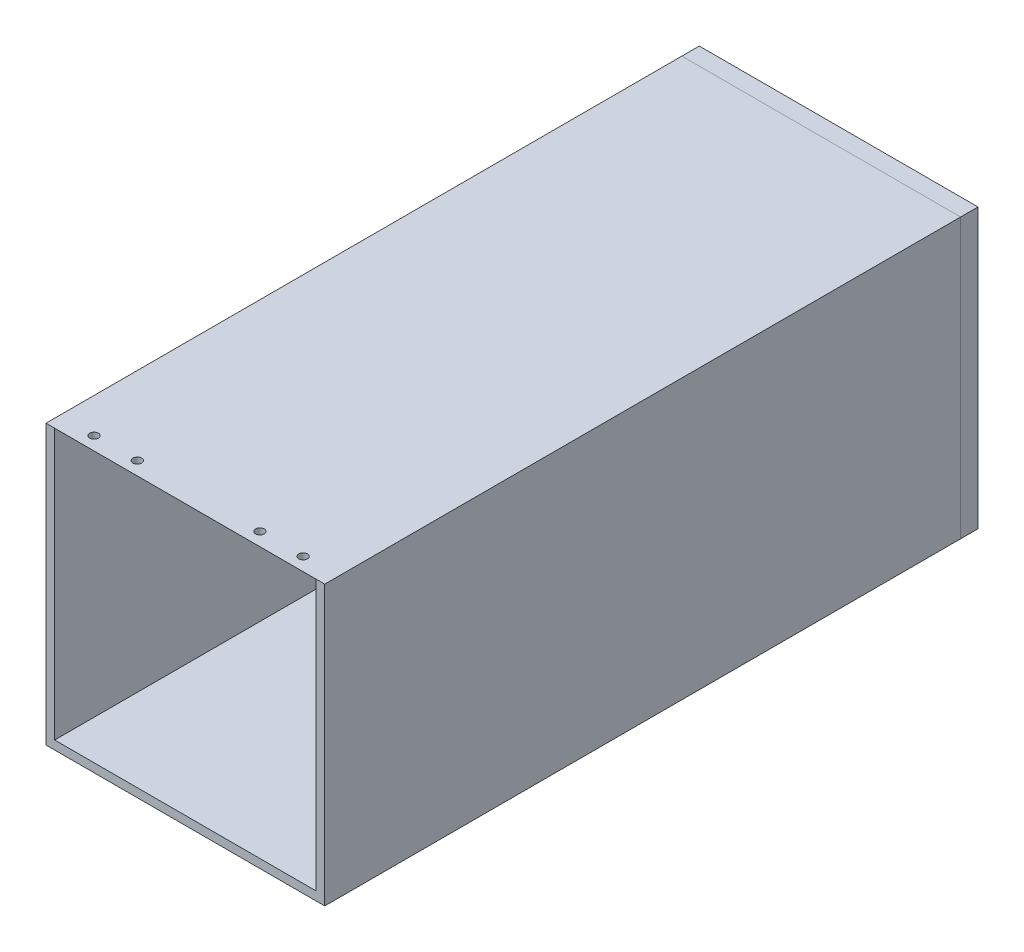
ISO-10303-21;
HEADER;
FILE_DESCRIPTION(('STEP AP214'),'2;1');
FILE_NAME('part.step','',(''),(''),'','','');
FILE_SCHEMA(('AUTOMOTIVE_DESIGN { 1 0 10303 214 1 1 1 1 }'));
ENDSEC;
DATA;
#1=APPLICATION_CONTEXT('core data for automotive mechanical design processes');
#2=APPLICATION_PROTOCOL_DEFINITION('international standard','automotive_design',2000,#1);
#3=PRODUCT_CONTEXT('',#1,'mechanical');
#4=PRODUCT('Part','Part','',(#3));
#5=PRODUCT_RELATED_PRODUCT_CATEGORY('part','',(#4));
#6=PRODUCT_DEFINITION_FORMATION('','',#4);
#7=PRODUCT_DEFINITION_CONTEXT('part definition',#1,'design');
#8=PRODUCT_DEFINITION('design','',#6,#7);
#9=PRODUCT_DEFINITION_SHAPE('','',#8);
#10=(LENGTH_UNIT() NAMED_UNIT(*) SI_UNIT(.MILLI.,.METRE.));
#11=(NAMED_UNIT(*) PLANE_ANGLE_UNIT() SI_UNIT($,.RADIAN.));
#12=(NAMED_UNIT(*) SI_UNIT($,.STERADIAN.) SOLID_ANGLE_UNIT());
#13=UNCERTAINTY_MEASURE_WITH_UNIT(LENGTH_MEASURE(1.E-05),#10,'distance_accuracy_value','');
#14=(GEOMETRIC_REPRESENTATION_CONTEXT(3) GLOBAL_UNCERTAINTY_ASSIGNED_CONTEXT((#13)) GLOBAL_UNIT_ASSIGNED_CONTEXT((#10,
#11,#12)) REPRESENTATION_CONTEXT('',''));
#15=CARTESIAN_POINT('',(0.,0.,0.));
#16=DIRECTION('',(0.,0.,1.));
#17=DIRECTION('',(1.,0.,0.));
#18=AXIS2_PLACEMENT_3D('',#15,#16,#17);
#19=CARTESIAN_POINT('',(-101.6,101.6,-6.35));
#20=DIRECTION('',(0.,-1.,0.));
#21=DIRECTION('',(0.,0.,-1.));
#22=AXIS2_PLACEMENT_3D('',#19,#20,#21);
#23=PLANE('',#22);
#24=DIRECTION('',(1.,0.,0.));
#25=VECTOR('',#24,1.);
#26=CARTESIAN_POINT('',(-101.6,101.6,0.));
#27=LINE('',#26,#25);
#28=CARTESIAN_POINT('',(-101.6,101.6,0.));
#29=VERTEX_POINT('',#28);
#30=CARTESIAN_POINT('',(0.,101.6,0.));
#31=VERTEX_POINT('',#30);
#32=EDGE_CURVE('E111',#29,#31,#27,.T.);
#33=ORIENTED_EDGE('',*,*,#32,.T.);
#34=DIRECTION('',(0.,0.,1.));
#35=VECTOR('',#34,1.);
#36=CARTESIAN_POINT('',(0.,101.6,-6.35));
#37=LINE('',#36,#35);
#38=CARTESIAN_POINT('',(0.,101.6,-6.35));
#39=VERTEX_POINT('',#38);
#40=EDGE_CURVE('E12',#39,#31,#37,.T.);
#41=ORIENTED_EDGE('',*,*,#40,.F.);
#42=DIRECTION('',(1.,0.,0.));
#43=VECTOR('',#42,1.);
#44=CARTESIAN_POINT('',(-101.6,101.6,-6.35));
#45=LINE('',#44,#43);
#46=CARTESIAN_POINT('',(-101.6,101.6,-6.35));
#47=VERTEX_POINT('',#46);
#48=EDGE_CURVE('E105',#47,#39,#45,.T.);
#49=ORIENTED_EDGE('',*,*,#48,.F.);
#50=DIRECTION('',(0.,0.,1.));
#51=VECTOR('',#50,1.);
#52=CARTESIAN_POINT('',(-101.6,101.6,-6.35));
#53=LINE('',#52,#51);
#54=EDGE_CURVE('E109',#47,#29,#53,.T.);
#55=ORIENTED_EDGE('',*,*,#54,.T.);
#56=EDGE_LOOP('',(#33,#41,#49,#55));
#57=FACE_BOUND('',#56,.T.);
#58=ADVANCED_FACE('F51',(#57),#23,.F.);
#59=CARTESIAN_POINT('',(0.,101.6,-6.35));
#60=DIRECTION('',(-1.,0.,0.));
#61=DIRECTION('',(0.,-1.,0.));
#62=AXIS2_PLACEMENT_3D('',#59,#60,#61);
#63=PLANE('',#62);
#64=DIRECTION('',(0.,-1.,0.));
#65=VECTOR('',#64,1.);
#66=CARTESIAN_POINT('',(0.,101.6,0.));
#67=LINE('',#66,#65);
#68=CARTESIAN_POINT('',(0.,0.,0.));
#69=VERTEX_POINT('',#68);
#70=EDGE_CURVE('E106',#31,#69,#67,.T.);
#71=ORIENTED_EDGE('',*,*,#70,.T.);
#72=DIRECTION('',(0.,0.,1.));
#73=VECTOR('',#72,1.);
#74=CARTESIAN_POINT('',(0.,0.,-6.35));
#75=LINE('',#74,#73);
#76=CARTESIAN_POINT('',(0.,0.,-6.35));
#77=VERTEX_POINT('',#76);
#78=EDGE_CURVE('E56',#77,#69,#75,.T.);
#79=ORIENTED_EDGE('',*,*,#78,.F.);
#80=DIRECTION('',(0.,-1.,0.));
#81=VECTOR('',#80,1.);
#82=CARTESIAN_POINT('',(0.,101.6,-6.35));
#83=LINE('',#82,#81);
#84=EDGE_CURVE('E100',#39,#77,#83,.T.);
#85=ORIENTED_EDGE('',*,*,#84,.F.);
#86=ORIENTED_EDGE('',*,*,#40,.T.);
#87=EDGE_LOOP('',(#71,#79,#85,#86));
#88=FACE_BOUND('',#87,.T.);
#89=ADVANCED_FACE('F104',(#88),#63,.F.);
#90=CARTESIAN_POINT('',(0.,0.,-6.35));
#91=DIRECTION('',(0.,1.,0.));
#92=DIRECTION('',(-1.,0.,0.));
#93=AXIS2_PLACEMENT_3D('',#90,#91,#92);
#94=PLANE('',#93);
#95=DIRECTION('',(-1.,0.,0.));
#96=VECTOR('',#95,1.);
#97=CARTESIAN_POINT('',(0.,0.,0.));
#98=LINE('',#97,#96);
#99=CARTESIAN_POINT('',(-101.6,0.,0.));
#100=VERTEX_POINT('',#99);
#101=EDGE_CURVE('E84',#69,#100,#98,.T.);
#102=ORIENTED_EDGE('',*,*,#101,.T.);
#103=DIRECTION('',(0.,0.,1.));
#104=VECTOR('',#103,1.);
#105=CARTESIAN_POINT('',(-101.6,0.,-6.35));
#106=LINE('',#105,#104);
#107=CARTESIAN_POINT('',(-101.6,0.,-6.35));
#108=VERTEX_POINT('',#107);
#109=EDGE_CURVE('E110',#108,#100,#106,.T.);
#110=ORIENTED_EDGE('',*,*,#109,.F.);
#111=DIRECTION('',(-1.,0.,0.));
#112=VECTOR('',#111,1.);
#113=CARTESIAN_POINT('',(0.,0.,-6.35));
#114=LINE('',#113,#112);
#115=EDGE_CURVE('E99',#77,#108,#114,.T.);
#116=ORIENTED_EDGE('',*,*,#115,.F.);
#117=ORIENTED_EDGE('',*,*,#78,.T.);
#118=EDGE_LOOP('',(#102,#110,#116,#117));
#119=FACE_BOUND('',#118,.T.);
#120=ADVANCED_FACE('F107',(#119),#94,.F.);
#121=CARTESIAN_POINT('',(-101.6,0.,-6.35));
#122=DIRECTION('',(1.,0.,0.));
#123=DIRECTION('',(0.,1.,0.));
#124=AXIS2_PLACEMENT_3D('',#121,#122,#123);
#125=PLANE('',#124);
#126=DIRECTION('',(0.,1.,0.));
#127=VECTOR('',#126,1.);
#128=CARTESIAN_POINT('',(-101.6,0.,0.));
#129=LINE('',#128,#127);
#130=EDGE_CURVE('E89',#100,#29,#129,.T.);
#131=ORIENTED_EDGE('',*,*,#130,.T.);
#132=ORIENTED_EDGE('',*,*,#54,.F.);
#133=DIRECTION('',(0.,1.,0.));
#134=VECTOR('',#133,1.);
#135=CARTESIAN_POINT('',(-101.6,0.,-6.35));
#136=LINE('',#135,#134);
#137=EDGE_CURVE('E70',#108,#47,#136,.T.);
#138=ORIENTED_EDGE('',*,*,#137,.F.);
#139=ORIENTED_EDGE('',*,*,#109,.T.);
#140=EDGE_LOOP('',(#131,#132,#138,#139));
#141=FACE_BOUND('',#140,.T.);
#142=ADVANCED_FACE('F122',(#141),#125,.F.);
#143=CARTESIAN_POINT('',(0.,0.,-6.35));
#144=DIRECTION('',(0.,0.,-1.));
#145=DIRECTION('',(-1.,0.,0.));
#146=AXIS2_PLACEMENT_3D('',#143,#144,#145);
#147=PLANE('',#146);
#148=ORIENTED_EDGE('',*,*,#48,.T.);
#149=ORIENTED_EDGE('',*,*,#84,.T.);
#150=ORIENTED_EDGE('',*,*,#115,.T.);
#151=ORIENTED_EDGE('',*,*,#137,.T.);
#152=EDGE_LOOP('',(#148,#149,#150,#151));
#153=FACE_BOUND('',#152,.T.);
#154=ADVANCED_FACE('F98',(#153),#147,.T.);
#155=CARTESIAN_POINT('',(0.,0.,0.));
#156=DIRECTION('',(0.,0.,-1.));
#157=DIRECTION('',(-1.,0.,0.));
#158=AXIS2_PLACEMENT_3D('',#155,#156,#157);
#159=PLANE('',#158);
#160=ORIENTED_EDGE('',*,*,#32,.F.);
#161=ORIENTED_EDGE('',*,*,#130,.F.);
#162=ORIENTED_EDGE('',*,*,#101,.F.);
#163=ORIENTED_EDGE('',*,*,#70,.F.);
#164=EDGE_LOOP('',(#160,#161,#162,#163));
#165=FACE_BOUND('',#164,.T.);
#166=ADVANCED_FACE('F124',(#165),#159,.F.);
#167=CLOSED_SHELL('',(#58,#89,#120,#142,#154,#166));
#168=MANIFOLD_SOLID_BREP('B2',#167);
#169=CARTESIAN_POINT('',(0.,0.,231.775));
#170=DIRECTION('',(0.,0.,1.));
#171=DIRECTION('',(1.,0.,0.));
#172=AXIS2_PLACEMENT_3D('',#169,#170,#171);
#173=PLANE('',#172);
#174=DIRECTION('',(0.,-1.,0.));
#175=VECTOR('',#174,1.);
#176=CARTESIAN_POINT('',(-98.425,98.425,231.775));
#177=LINE('',#176,#175);
#178=CARTESIAN_POINT('',(-98.425,101.6,231.775));
#179=VERTEX_POINT('',#178);
#180=CARTESIAN_POINT('',(-98.425,3.17499999999999,231.775));
#181=VERTEX_POINT('',#180);
#182=EDGE_CURVE('E193',#179,#181,#177,.T.);
#183=ORIENTED_EDGE('',*,*,#182,.F.);
#184=DIRECTION('',(-1.,0.,0.));
#185=VECTOR('',#184,1.);
#186=CARTESIAN_POINT('',(0.,101.6,231.775));
#187=LINE('',#186,#185);
#188=CARTESIAN_POINT('',(-101.6,101.6,231.775));
#189=VERTEX_POINT('',#188);
#190=EDGE_CURVE('E287',#179,#189,#187,.T.);
#191=ORIENTED_EDGE('',*,*,#190,.T.);
#192=DIRECTION('',(0.,-1.,0.));
#193=VECTOR('',#192,1.);
#194=CARTESIAN_POINT('',(-101.6,0.,231.775));
#195=LINE('',#194,#193);
#196=CARTESIAN_POINT('',(-101.6,0.,231.775));
#197=VERTEX_POINT('',#196);
#198=EDGE_CURVE('E286',#189,#197,#195,.T.);
#199=ORIENTED_EDGE('',*,*,#198,.T.);
#200=DIRECTION('',(1.,0.,0.));
#201=VECTOR('',#200,1.);
#202=CARTESIAN_POINT('',(0.,0.,231.775));
#203=LINE('',#202,#201);
#204=CARTESIAN_POINT('',(0.,0.,231.775));
#205=VERTEX_POINT('',#204);
#206=EDGE_CURVE('E291',#197,#205,#203,.T.);
#207=ORIENTED_EDGE('',*,*,#206,.T.);
#208=DIRECTION('',(0.,1.,0.));
#209=VECTOR('',#208,1.);
#210=CARTESIAN_POINT('',(0.,0.,231.775));
#211=LINE('',#210,#209);
#212=CARTESIAN_POINT('',(0.,101.6,231.775));
#213=VERTEX_POINT('',#212);
#214=EDGE_CURVE('E285',#205,#213,#211,.T.);
#215=ORIENTED_EDGE('',*,*,#214,.T.);
#216=CARTESIAN_POINT('',(-3.175,101.6,231.775));
#217=VERTEX_POINT('',#216);
#218=EDGE_CURVE('E288',#213,#217,#187,.T.);
#219=ORIENTED_EDGE('',*,*,#218,.T.);
#220=DIRECTION('',(0.,1.,0.));
#221=VECTOR('',#220,1.);
#222=CARTESIAN_POINT('',(-3.175,98.425,231.775));
#223=LINE('',#222,#221);
#224=CARTESIAN_POINT('',(-3.17499999999998,3.17499999999999,231.775));
#225=VERTEX_POINT('',#224);
#226=EDGE_CURVE('E199',#225,#217,#223,.T.);
#227=ORIENTED_EDGE('',*,*,#226,.F.);
#228=DIRECTION('',(1.,0.,0.));
#229=VECTOR('',#228,1.);
#230=CARTESIAN_POINT('',(-98.425,3.17499999999999,231.775));
#231=LINE('',#230,#229);
#232=EDGE_CURVE('E254',#181,#225,#231,.T.);
#233=ORIENTED_EDGE('',*,*,#232,.F.);
#234=EDGE_LOOP('',(#183,#191,#199,#207,#215,#219,#227,#233));
#235=FACE_BOUND('',#234,.T.);
#236=ADVANCED_FACE('F172',(#235),#173,.T.);
#237=CARTESIAN_POINT('',(0.,0.,0.));
#238=DIRECTION('',(0.,0.,1.));
#239=DIRECTION('',(1.,0.,0.));
#240=AXIS2_PLACEMENT_3D('',#237,#238,#239);
#241=PLANE('',#240);
#242=DIRECTION('',(0.,1.,0.));
#243=VECTOR('',#242,1.);
#244=CARTESIAN_POINT('',(0.,0.,0.));
#245=LINE('',#244,#243);
#246=CARTESIAN_POINT('',(0.,0.,0.));
#247=VERTEX_POINT('',#246);
#248=CARTESIAN_POINT('',(0.,101.6,0.));
#249=VERTEX_POINT('',#248);
#250=EDGE_CURVE('E265',#247,#249,#245,.T.);
#251=ORIENTED_EDGE('',*,*,#250,.F.);
#252=DIRECTION('',(1.,0.,0.));
#253=VECTOR('',#252,1.);
#254=CARTESIAN_POINT('',(0.,0.,0.));
#255=LINE('',#254,#253);
#256=CARTESIAN_POINT('',(-101.6,0.,0.));
#257=VERTEX_POINT('',#256);
#258=EDGE_CURVE('E290',#257,#247,#255,.T.);
#259=ORIENTED_EDGE('',*,*,#258,.F.);
#260=DIRECTION('',(0.,-1.,0.));
#261=VECTOR('',#260,1.);
#262=CARTESIAN_POINT('',(-101.6,0.,0.));
#263=LINE('',#262,#261);
#264=CARTESIAN_POINT('',(-101.6,101.6,0.));
#265=VERTEX_POINT('',#264);
#266=EDGE_CURVE('E297',#265,#257,#263,.T.);
#267=ORIENTED_EDGE('',*,*,#266,.F.);
#268=DIRECTION('',(-1.,0.,0.));
#269=VECTOR('',#268,1.);
#270=CARTESIAN_POINT('',(0.,101.6,0.));
#271=LINE('',#270,#269);
#272=EDGE_CURVE('E300',#249,#265,#271,.T.);
#273=ORIENTED_EDGE('',*,*,#272,.F.);
#274=EDGE_LOOP('',(#251,#259,#267,#273));
#275=FACE_BOUND('',#274,.T.);
#276=DIRECTION('',(0.,-1.,0.));
#277=VECTOR('',#276,1.);
#278=CARTESIAN_POINT('',(-98.425,98.425,0.));
#279=LINE('',#278,#277);
#280=CARTESIAN_POINT('',(-98.425,98.425,0.));
#281=VERTEX_POINT('',#280);
#282=CARTESIAN_POINT('',(-98.425,3.17499999999999,0.));
#283=VERTEX_POINT('',#282);
#284=EDGE_CURVE('E271',#281,#283,#279,.T.);
#285=ORIENTED_EDGE('',*,*,#284,.T.);
#286=DIRECTION('',(1.,0.,0.));
#287=VECTOR('',#286,1.);
#288=CARTESIAN_POINT('',(-98.425,3.17499999999999,0.));
#289=LINE('',#288,#287);
#290=CARTESIAN_POINT('',(-3.17499999999998,3.17499999999999,0.));
#291=VERTEX_POINT('',#290);
#292=EDGE_CURVE('E261',#283,#291,#289,.T.);
#293=ORIENTED_EDGE('',*,*,#292,.T.);
#294=DIRECTION('',(0.,1.,0.));
#295=VECTOR('',#294,1.);
#296=CARTESIAN_POINT('',(-3.175,98.425,0.));
#297=LINE('',#296,#295);
#298=CARTESIAN_POINT('',(-3.175,98.425,0.));
#299=VERTEX_POINT('',#298);
#300=EDGE_CURVE('E273',#291,#299,#297,.T.);
#301=ORIENTED_EDGE('',*,*,#300,.T.);
#302=DIRECTION('',(-1.,0.,0.));
#303=VECTOR('',#302,1.);
#304=CARTESIAN_POINT('',(-98.425,98.425,0.));
#305=LINE('',#304,#303);
#306=EDGE_CURVE('E258',#299,#281,#305,.T.);
#307=ORIENTED_EDGE('',*,*,#306,.T.);
#308=EDGE_LOOP('',(#285,#293,#301,#307));
#309=FACE_BOUND('',#308,.T.);
#310=ADVANCED_FACE('F367',(#275,#309),#241,.F.);
#311=CARTESIAN_POINT('',(0.,0.,231.775));
#312=DIRECTION('',(-1.,0.,0.));
#313=DIRECTION('',(0.,-1.,0.));
#314=AXIS2_PLACEMENT_3D('',#311,#312,#313);
#315=PLANE('',#314);
#316=ORIENTED_EDGE('',*,*,#250,.T.);
#317=DIRECTION('',(0.,0.,-1.));
#318=VECTOR('',#317,1.);
#319=CARTESIAN_POINT('',(0.,101.6,231.775));
#320=LINE('',#319,#318);
#321=EDGE_CURVE('E313',#213,#249,#320,.T.);
#322=ORIENTED_EDGE('',*,*,#321,.F.);
#323=ORIENTED_EDGE('',*,*,#214,.F.);
#324=DIRECTION('',(0.,0.,-1.));
#325=VECTOR('',#324,1.);
#326=CARTESIAN_POINT('',(0.,0.,231.775));
#327=LINE('',#326,#325);
#328=EDGE_CURVE('E293',#205,#247,#327,.T.);
#329=ORIENTED_EDGE('',*,*,#328,.T.);
#330=EDGE_LOOP('',(#316,#322,#323,#329));
#331=FACE_BOUND('',#330,.T.);
#332=ADVANCED_FACE('F370',(#331),#315,.F.);
#333=CARTESIAN_POINT('',(0.,101.6,231.775));
#334=DIRECTION('',(0.,-1.,0.));
#335=DIRECTION('',(0.,0.,-1.));
#336=AXIS2_PLACEMENT_3D('',#333,#334,#335);
#337=PLANE('',#336);
#338=CARTESIAN_POINT('',(-88.9,101.6,226.949));
#339=DIRECTION('',(0.,1.,0.));
#340=DIRECTION('',(0.,0.,1.));
#341=AXIS2_PLACEMENT_3D('',#338,#339,#340);
#342=CIRCLE('',#341,1.58749999999999);
#343=CARTESIAN_POINT('',(-88.9,101.6,228.5365));
#344=VERTEX_POINT('',#343);
#345=EDGE_CURVE('E325',#344,#344,#342,.T.);
#346=ORIENTED_EDGE('',*,*,#345,.F.);
#347=EDGE_LOOP('',(#346));
#348=FACE_BOUND('',#347,.T.);
#349=CARTESIAN_POINT('',(-73.152,101.6,226.949));
#350=DIRECTION('',(0.,1.,0.));
#351=DIRECTION('',(0.,0.,1.));
#352=AXIS2_PLACEMENT_3D('',#349,#350,#351);
#353=CIRCLE('',#352,1.5875);
#354=CARTESIAN_POINT('',(-73.152,101.6,228.5365));
#355=VERTEX_POINT('',#354);
#356=EDGE_CURVE('E479',#355,#355,#353,.T.);
#357=ORIENTED_EDGE('',*,*,#356,.F.);
#358=EDGE_LOOP('',(#357));
#359=FACE_BOUND('',#358,.T.);
#360=CARTESIAN_POINT('',(-28.448,101.6,226.949));
#361=DIRECTION('',(0.,1.,0.));
#362=DIRECTION('',(0.,0.,1.));
#363=AXIS2_PLACEMENT_3D('',#360,#361,#362);
#364=CIRCLE('',#363,1.5875);
#365=CARTESIAN_POINT('',(-28.448,101.6,228.5365));
#366=VERTEX_POINT('',#365);
#367=EDGE_CURVE('E481',#366,#366,#364,.T.);
#368=ORIENTED_EDGE('',*,*,#367,.F.);
#369=EDGE_LOOP('',(#368));
#370=FACE_BOUND('',#369,.T.);
#371=CARTESIAN_POINT('',(-12.7,101.6,226.949));
#372=DIRECTION('',(0.,1.,0.));
#373=DIRECTION('',(0.,0.,1.));
#374=AXIS2_PLACEMENT_3D('',#371,#372,#373);
#375=CIRCLE('',#374,1.5875);
#376=CARTESIAN_POINT('',(-12.7,101.6,228.5365));
#377=VERTEX_POINT('',#376);
#378=EDGE_CURVE('E486',#377,#377,#375,.T.);
#379=ORIENTED_EDGE('',*,*,#378,.F.);
#380=EDGE_LOOP('',(#379));
#381=FACE_BOUND('',#380,.T.);
#382=ORIENTED_EDGE('',*,*,#272,.T.);
#383=DIRECTION('',(0.,0.,-1.));
#384=VECTOR('',#383,1.);
#385=CARTESIAN_POINT('',(-101.6,101.6,231.775));
#386=LINE('',#385,#384);
#387=EDGE_CURVE('E306',#189,#265,#386,.T.);
#388=ORIENTED_EDGE('',*,*,#387,.F.);
#389=ORIENTED_EDGE('',*,*,#190,.F.);
#390=EDGE_CURVE('E292',#217,#179,#187,.T.);
#391=ORIENTED_EDGE('',*,*,#390,.F.);
#392=ORIENTED_EDGE('',*,*,#218,.F.);
#393=ORIENTED_EDGE('',*,*,#321,.T.);
#394=EDGE_LOOP('',(#382,#388,#389,#391,#392,#393));
#395=FACE_BOUND('',#394,.T.);
#396=ADVANCED_FACE('F352',(#348,#359,#370,#381,#395),#337,.F.);
#397=CARTESIAN_POINT('',(-101.6,0.,231.775));
#398=DIRECTION('',(1.,0.,0.));
#399=DIRECTION('',(0.,1.,0.));
#400=AXIS2_PLACEMENT_3D('',#397,#398,#399);
#401=PLANE('',#400);
#402=ORIENTED_EDGE('',*,*,#266,.T.);
#403=DIRECTION('',(0.,0.,-1.));
#404=VECTOR('',#403,1.);
#405=CARTESIAN_POINT('',(-101.6,0.,231.775));
#406=LINE('',#405,#404);
#407=EDGE_CURVE('E301',#197,#257,#406,.T.);
#408=ORIENTED_EDGE('',*,*,#407,.F.);
#409=ORIENTED_EDGE('',*,*,#198,.F.);
#410=ORIENTED_EDGE('',*,*,#387,.T.);
#411=EDGE_LOOP('',(#402,#408,#409,#410));
#412=FACE_BOUND('',#411,.T.);
#413=ADVANCED_FACE('F358',(#412),#401,.F.);
#414=CARTESIAN_POINT('',(0.,0.,231.775));
#415=DIRECTION('',(0.,1.,0.));
#416=DIRECTION('',(-1.,0.,0.));
#417=AXIS2_PLACEMENT_3D('',#414,#415,#416);
#418=PLANE('',#417);
#419=ORIENTED_EDGE('',*,*,#258,.T.);
#420=ORIENTED_EDGE('',*,*,#328,.F.);
#421=ORIENTED_EDGE('',*,*,#206,.F.);
#422=ORIENTED_EDGE('',*,*,#407,.T.);
#423=EDGE_LOOP('',(#419,#420,#421,#422));
#424=FACE_BOUND('',#423,.T.);
#425=ADVANCED_FACE('F361',(#424),#418,.F.);
#426=CARTESIAN_POINT('',(-98.425,98.425,231.775));
#427=DIRECTION('',(1.,0.,0.));
#428=DIRECTION('',(0.,1.,0.));
#429=AXIS2_PLACEMENT_3D('',#426,#427,#428);
#430=PLANE('',#429);
#431=ORIENTED_EDGE('',*,*,#284,.F.);
#432=DIRECTION('',(0.,0.,-1.));
#433=VECTOR('',#432,1.);
#434=CARTESIAN_POINT('',(-98.425,98.425,231.775));
#435=LINE('',#434,#433);
#436=CARTESIAN_POINT('',(-98.425,98.425,228.6));
#437=VERTEX_POINT('',#436);
#438=EDGE_CURVE('E270',#437,#281,#435,.T.);
#439=ORIENTED_EDGE('',*,*,#438,.F.);
#440=DIRECTION('',(0.,-0.707106781186548,-0.707106781186548));
#441=VECTOR('',#440,1.);
#442=CARTESIAN_POINT('',(-98.425,98.425,228.6));
#443=LINE('',#442,#441);
#444=EDGE_CURVE('E183',#437,#179,#443,.F.);
#445=ORIENTED_EDGE('',*,*,#444,.T.);
#446=ORIENTED_EDGE('',*,*,#182,.T.);
#447=DIRECTION('',(0.,0.,-1.));
#448=VECTOR('',#447,1.);
#449=CARTESIAN_POINT('',(-98.425,3.17499999999999,231.775));
#450=LINE('',#449,#448);
#451=EDGE_CURVE('E253',#181,#283,#450,.T.);
#452=ORIENTED_EDGE('',*,*,#451,.T.);
#453=EDGE_LOOP('',(#431,#439,#445,#446,#452));
#454=FACE_BOUND('',#453,.T.);
#455=ADVANCED_FACE('F246',(#454),#430,.T.);
#456=CARTESIAN_POINT('',(-98.425,3.17499999999999,231.775));
#457=DIRECTION('',(0.,1.,0.));
#458=DIRECTION('',(0.,0.,1.));
#459=AXIS2_PLACEMENT_3D('',#456,#457,#458);
#460=PLANE('',#459);
#461=ORIENTED_EDGE('',*,*,#292,.F.);
#462=ORIENTED_EDGE('',*,*,#451,.F.);
#463=ORIENTED_EDGE('',*,*,#232,.T.);
#464=DIRECTION('',(0.,0.,-1.));
#465=VECTOR('',#464,1.);
#466=CARTESIAN_POINT('',(-3.17499999999998,3.17499999999999,231.775));
#467=LINE('',#466,#465);
#468=EDGE_CURVE('E263',#225,#291,#467,.T.);
#469=ORIENTED_EDGE('',*,*,#468,.T.);
#470=EDGE_LOOP('',(#461,#462,#463,#469));
#471=FACE_BOUND('',#470,.T.);
#472=ADVANCED_FACE('F259',(#471),#460,.T.);
#473=CARTESIAN_POINT('',(-3.175,98.425,231.775));
#474=DIRECTION('',(-1.,0.,0.));
#475=DIRECTION('',(0.,-1.,0.));
#476=AXIS2_PLACEMENT_3D('',#473,#474,#475);
#477=PLANE('',#476);
#478=ORIENTED_EDGE('',*,*,#300,.F.);
#479=ORIENTED_EDGE('',*,*,#468,.F.);
#480=ORIENTED_EDGE('',*,*,#226,.T.);
#481=DIRECTION('',(0.,0.707106781186548,0.707106781186548));
#482=VECTOR('',#481,1.);
#483=CARTESIAN_POINT('',(-3.175,98.425,228.6));
#484=LINE('',#483,#482);
#485=CARTESIAN_POINT('',(-3.175,98.425,228.6));
#486=VERTEX_POINT('',#485);
#487=EDGE_CURVE('E47',#217,#486,#484,.F.);
#488=ORIENTED_EDGE('',*,*,#487,.T.);
#489=DIRECTION('',(0.,0.,-1.));
#490=VECTOR('',#489,1.);
#491=CARTESIAN_POINT('',(-3.175,98.425,231.775));
#492=LINE('',#491,#490);
#493=EDGE_CURVE('E278',#486,#299,#492,.T.);
#494=ORIENTED_EDGE('',*,*,#493,.T.);
#495=EDGE_LOOP('',(#478,#479,#480,#488,#494));
#496=FACE_BOUND('',#495,.T.);
#497=ADVANCED_FACE('F336',(#496),#477,.T.);
#498=CARTESIAN_POINT('',(-98.425,98.425,231.775));
#499=DIRECTION('',(0.,-1.,0.));
#500=DIRECTION('',(0.,0.,-1.));
#501=AXIS2_PLACEMENT_3D('',#498,#499,#500);
#502=PLANE('',#501);
#503=CARTESIAN_POINT('',(-88.9,98.425,226.949));
#504=DIRECTION('',(0.,-1.,0.));
#505=DIRECTION('',(0.,0.,-1.));
#506=AXIS2_PLACEMENT_3D('',#503,#504,#505);
#507=CIRCLE('',#506,1.58749999999999);
#508=CARTESIAN_POINT('',(-88.9,98.425,228.5365));
#509=VERTEX_POINT('',#508);
#510=EDGE_CURVE('E176',#509,#509,#507,.T.);
#511=ORIENTED_EDGE('',*,*,#510,.F.);
#512=EDGE_LOOP('',(#511));
#513=FACE_BOUND('',#512,.T.);
#514=CARTESIAN_POINT('',(-73.152,98.425,226.949));
#515=DIRECTION('',(0.,-1.,0.));
#516=DIRECTION('',(0.,0.,-1.));
#517=AXIS2_PLACEMENT_3D('',#514,#515,#516);
#518=CIRCLE('',#517,1.5875);
#519=CARTESIAN_POINT('',(-73.152,98.425,228.5365));
#520=VERTEX_POINT('',#519);
#521=EDGE_CURVE('E322',#520,#520,#518,.T.);
#522=ORIENTED_EDGE('',*,*,#521,.F.);
#523=EDGE_LOOP('',(#522));
#524=FACE_BOUND('',#523,.T.);
#525=CARTESIAN_POINT('',(-28.448,98.425,226.949));
#526=DIRECTION('',(0.,-1.,0.));
#527=DIRECTION('',(0.,0.,-1.));
#528=AXIS2_PLACEMENT_3D('',#525,#526,#527);
#529=CIRCLE('',#528,1.5875);
#530=CARTESIAN_POINT('',(-28.448,98.425,228.5365));
#531=VERTEX_POINT('',#530);
#532=EDGE_CURVE('E321',#531,#531,#529,.T.);
#533=ORIENTED_EDGE('',*,*,#532,.F.);
#534=EDGE_LOOP('',(#533));
#535=FACE_BOUND('',#534,.T.);
#536=CARTESIAN_POINT('',(-12.7,98.425,226.949));
#537=DIRECTION('',(0.,-1.,0.));
#538=DIRECTION('',(0.,0.,-1.));
#539=AXIS2_PLACEMENT_3D('',#536,#537,#538);
#540=CIRCLE('',#539,1.5875);
#541=CARTESIAN_POINT('',(-12.7,98.425,228.5365));
#542=VERTEX_POINT('',#541);
#543=EDGE_CURVE('E318',#542,#542,#540,.T.);
#544=ORIENTED_EDGE('',*,*,#543,.F.);
#545=EDGE_LOOP('',(#544));
#546=FACE_BOUND('',#545,.T.);
#547=ORIENTED_EDGE('',*,*,#493,.F.);
#548=DIRECTION('',(-1.,0.,0.));
#549=VECTOR('',#548,1.);
#550=CARTESIAN_POINT('',(-98.425,98.425,228.6));
#551=LINE('',#550,#549);
#552=EDGE_CURVE('E314',#486,#437,#551,.T.);
#553=ORIENTED_EDGE('',*,*,#552,.T.);
#554=ORIENTED_EDGE('',*,*,#438,.T.);
#555=ORIENTED_EDGE('',*,*,#306,.F.);
#556=EDGE_LOOP('',(#547,#553,#554,#555));
#557=FACE_BOUND('',#556,.T.);
#558=ADVANCED_FACE('F331',(#513,#524,#535,#546,#557),#502,.T.);
#559=CARTESIAN_POINT('',(-98.425,98.425,228.6));
#560=DIRECTION('',(0.,0.707106781186548,-0.707106781186548));
#561=DIRECTION('',(-1.,0.,0.));
#562=AXIS2_PLACEMENT_3D('',#559,#560,#561);
#563=PLANE('',#562);
#564=ORIENTED_EDGE('',*,*,#487,.F.);
#565=ORIENTED_EDGE('',*,*,#390,.T.);
#566=ORIENTED_EDGE('',*,*,#444,.F.);
#567=ORIENTED_EDGE('',*,*,#552,.F.);
#568=EDGE_LOOP('',(#564,#565,#566,#567));
#569=FACE_BOUND('',#568,.T.);
#570=ADVANCED_FACE('F178',(#569),#563,.F.);
#571=CARTESIAN_POINT('',(-12.7,83.82,226.949));
#572=DIRECTION('',(0.,1.,0.));
#573=DIRECTION('',(0.,0.,1.));
#574=AXIS2_PLACEMENT_3D('',#571,#572,#573);
#575=CYLINDRICAL_SURFACE('',#574,1.5875);
#576=CARTESIAN_POINT('',(-12.7,98.425,228.5365));
#577=CARTESIAN_POINT('',(-12.7,98.4580729166667,228.5365));
#578=CARTESIAN_POINT('',(-12.7,98.4911458333333,228.5365));
#579=CARTESIAN_POINT('',(-12.7,98.5572916666667,228.5365));
#580=CARTESIAN_POINT('',(-12.7,98.5903645833333,228.5365));
#581=CARTESIAN_POINT('',(-12.7,98.6565104166667,228.5365));
#582=CARTESIAN_POINT('',(-12.7,98.6895833333333,228.5365));
#583=CARTESIAN_POINT('',(-12.7,98.7557291666667,228.5365));
#584=CARTESIAN_POINT('',(-12.7,98.7888020833333,228.5365));
#585=CARTESIAN_POINT('',(-12.7,98.8549479166667,228.5365));
#586=CARTESIAN_POINT('',(-12.7,98.8880208333333,228.5365));
#587=CARTESIAN_POINT('',(-12.7,98.9541666666667,228.5365));
#588=CARTESIAN_POINT('',(-12.7,98.9872395833333,228.5365));
#589=CARTESIAN_POINT('',(-12.7,99.0533854166667,228.5365));
#590=CARTESIAN_POINT('',(-12.7,99.0864583333333,228.5365));
#591=CARTESIAN_POINT('',(-12.7,99.1526041666667,228.5365));
#592=CARTESIAN_POINT('',(-12.7,99.1856770833333,228.5365));
#593=CARTESIAN_POINT('',(-12.7,99.2518229166667,228.5365));
#594=CARTESIAN_POINT('',(-12.7,99.2848958333333,228.5365));
#595=CARTESIAN_POINT('',(-12.7,99.3510416666667,228.5365));
#596=CARTESIAN_POINT('',(-12.7,99.3841145833333,228.5365));
#597=CARTESIAN_POINT('',(-12.7,99.4502604166667,228.5365));
#598=CARTESIAN_POINT('',(-12.7,99.4833333333333,228.5365));
#599=CARTESIAN_POINT('',(-12.7,99.5494791666667,228.5365));
#600=CARTESIAN_POINT('',(-12.7,99.5825520833333,228.5365));
#601=CARTESIAN_POINT('',(-12.7,99.6486979166666,228.5365));
#602=CARTESIAN_POINT('',(-12.7,99.6817708333333,228.5365));
#603=CARTESIAN_POINT('',(-12.7,99.7479166666667,228.5365));
#604=CARTESIAN_POINT('',(-12.7,99.7809895833333,228.5365));
#605=CARTESIAN_POINT('',(-12.7,99.8471354166667,228.5365));
#606=CARTESIAN_POINT('',(-12.7,99.8802083333333,228.5365));
#607=CARTESIAN_POINT('',(-12.7,99.9463541666667,228.5365));
#608=CARTESIAN_POINT('',(-12.7,99.9794270833333,228.5365));
#609=CARTESIAN_POINT('',(-12.7,100.045572916667,228.5365));
#610=CARTESIAN_POINT('',(-12.7,100.078645833333,228.5365));
#611=CARTESIAN_POINT('',(-12.7,100.144791666667,228.5365));
#612=CARTESIAN_POINT('',(-12.7,100.177864583333,228.5365));
#613=CARTESIAN_POINT('',(-12.7,100.244010416667,228.5365));
#614=CARTESIAN_POINT('',(-12.7,100.277083333333,228.5365));
#615=CARTESIAN_POINT('',(-12.7,100.343229166667,228.5365));
#616=CARTESIAN_POINT('',(-12.7,100.376302083333,228.5365));
#617=CARTESIAN_POINT('',(-12.7,100.442447916667,228.5365));
#618=CARTESIAN_POINT('',(-12.7,100.475520833333,228.5365));
#619=CARTESIAN_POINT('',(-12.7,100.541666666667,228.5365));
#620=CARTESIAN_POINT('',(-12.7,100.574739583333,228.5365));
#621=CARTESIAN_POINT('',(-12.7,100.640885416667,228.5365));
#622=CARTESIAN_POINT('',(-12.7,100.673958333333,228.5365));
#623=CARTESIAN_POINT('',(-12.7,100.740104166667,228.5365));
#624=CARTESIAN_POINT('',(-12.7,100.773177083333,228.5365));
#625=CARTESIAN_POINT('',(-12.7,100.839322916667,228.5365));
#626=CARTESIAN_POINT('',(-12.7,100.872395833333,228.5365));
#627=CARTESIAN_POINT('',(-12.7,100.938541666667,228.5365));
#628=CARTESIAN_POINT('',(-12.7,100.971614583333,228.5365));
#629=CARTESIAN_POINT('',(-12.7,101.037760416667,228.5365));
#630=CARTESIAN_POINT('',(-12.7,101.070833333333,228.5365));
#631=CARTESIAN_POINT('',(-12.7,101.136979166667,228.5365));
#632=CARTESIAN_POINT('',(-12.7,101.170052083333,228.5365));
#633=CARTESIAN_POINT('',(-12.7,101.236197916667,228.5365));
#634=CARTESIAN_POINT('',(-12.7,101.269270833333,228.5365));
#635=CARTESIAN_POINT('',(-12.7,101.335416666667,228.5365));
#636=CARTESIAN_POINT('',(-12.7,101.368489583333,228.5365));
#637=CARTESIAN_POINT('',(-12.7,101.434635416667,228.5365));
#638=CARTESIAN_POINT('',(-12.7,101.467708333333,228.5365));
#639=CARTESIAN_POINT('',(-12.7,101.533854166667,228.5365));
#640=CARTESIAN_POINT('',(-12.7,101.566927083333,228.5365));
#641=CARTESIAN_POINT('',(-12.7,101.6,228.5365));
#642=B_SPLINE_CURVE_WITH_KNOTS('',3,(#576,#577,#578,#579,#580,#581,#582,#583,#584,#585,#586,
#587,#588,#589,#590,#591,#592,#593,#594,#595,#596,#597,#598,#599,#600,#601,#602,#603,#604,#605,
#606,#607,#608,#609,#610,#611,#612,#613,#614,#615,#616,#617,#618,#619,#620,#621,#622,#623,#624,
#625,#626,#627,#628,#629,#630,#631,#632,#633,#634,#635,#636,#637,#638,#639,#640,#641),
.UNSPECIFIED.,.F.,.F.,(4,2,2,2,2,2,2,2,2,2,2,2,2,2,2,2,2,2,2,2,2,2,2,2,2,2,2,2,2,2,2,2,4),(0.,
0.0992187499999908,0.198437499999995,0.29765625,0.396874999999991,0.496093749999996,
0.595312499999986,0.694531249999991,0.793749999999996,0.892968749999987,0.992187499999991,
1.09140625,1.19062499999999,1.28984374999999,1.3890625,1.48828124999999,1.58749999999999,
1.68671875,1.78593749999999,1.88515624999999,1.984375,2.08359374999999,2.18281249999999,
2.28203125,2.38124999999999,2.48046874999999,2.57968749999998,2.67890624999999,2.77812499999999,
2.87734374999998,2.97656249999999,3.07578124999998,3.17499999999998),.UNSPECIFIED.);
#643=EDGE_CURVE('BSEAM438',#542,#377,#642,.T.);
#644=ORIENTED_EDGE('',*,*,#543,.T.);
#645=ORIENTED_EDGE('',*,*,#378,.T.);
#646=ORIENTED_EDGE('',*,*,#643,.T.);
#647=ORIENTED_EDGE('',*,*,#643,.F.);
#648=EDGE_LOOP('',(#644,#646,#645,#647));
#649=FACE_BOUND('',#648,.T.);
#650=ADVANCED_FACE('F438',(#649),#575,.F.);
#651=CARTESIAN_POINT('',(-28.448,83.82,226.949));
#652=DIRECTION('',(0.,1.,0.));
#653=DIRECTION('',(0.,0.,1.));
#654=AXIS2_PLACEMENT_3D('',#651,#652,#653);
#655=CYLINDRICAL_SURFACE('',#654,1.5875);
#656=CARTESIAN_POINT('',(-28.448,98.425,228.5365));
#657=CARTESIAN_POINT('',(-28.448,98.4580729166667,228.5365));
#658=CARTESIAN_POINT('',(-28.448,98.4911458333333,228.5365));
#659=CARTESIAN_POINT('',(-28.448,98.5572916666667,228.5365));
#660=CARTESIAN_POINT('',(-28.448,98.5903645833333,228.5365));
#661=CARTESIAN_POINT('',(-28.448,98.6565104166667,228.5365));
#662=CARTESIAN_POINT('',(-28.448,98.6895833333333,228.5365));
#663=CARTESIAN_POINT('',(-28.448,98.7557291666667,228.5365));
#664=CARTESIAN_POINT('',(-28.448,98.7888020833333,228.5365));
#665=CARTESIAN_POINT('',(-28.448,98.8549479166667,228.5365));
#666=CARTESIAN_POINT('',(-28.448,98.8880208333333,228.5365));
#667=CARTESIAN_POINT('',(-28.448,98.9541666666667,228.5365));
#668=CARTESIAN_POINT('',(-28.448,98.9872395833333,228.5365));
#669=CARTESIAN_POINT('',(-28.448,99.0533854166667,228.5365));
#670=CARTESIAN_POINT('',(-28.448,99.0864583333333,228.5365));
#671=CARTESIAN_POINT('',(-28.448,99.1526041666667,228.5365));
#672=CARTESIAN_POINT('',(-28.448,99.1856770833333,228.5365));
#673=CARTESIAN_POINT('',(-28.448,99.2518229166667,228.5365));
#674=CARTESIAN_POINT('',(-28.448,99.2848958333333,228.5365));
#675=CARTESIAN_POINT('',(-28.448,99.3510416666667,228.5365));
#676=CARTESIAN_POINT('',(-28.448,99.3841145833333,228.5365));
#677=CARTESIAN_POINT('',(-28.448,99.4502604166667,228.5365));
#678=CARTESIAN_POINT('',(-28.448,99.4833333333333,228.5365));
#679=CARTESIAN_POINT('',(-28.448,99.5494791666667,228.5365));
#680=CARTESIAN_POINT('',(-28.448,99.5825520833333,228.5365));
#681=CARTESIAN_POINT('',(-28.448,99.6486979166666,228.5365));
#682=CARTESIAN_POINT('',(-28.448,99.6817708333333,228.5365));
#683=CARTESIAN_POINT('',(-28.448,99.7479166666667,228.5365));
#684=CARTESIAN_POINT('',(-28.448,99.7809895833333,228.5365));
#685=CARTESIAN_POINT('',(-28.448,99.8471354166667,228.5365));
#686=CARTESIAN_POINT('',(-28.448,99.8802083333333,228.5365));
#687=CARTESIAN_POINT('',(-28.448,99.9463541666667,228.5365));
#688=CARTESIAN_POINT('',(-28.448,99.9794270833333,228.5365));
#689=CARTESIAN_POINT('',(-28.448,100.045572916667,228.5365));
#690=CARTESIAN_POINT('',(-28.448,100.078645833333,228.5365));
#691=CARTESIAN_POINT('',(-28.448,100.144791666667,228.5365));
#692=CARTESIAN_POINT('',(-28.448,100.177864583333,228.5365));
#693=CARTESIAN_POINT('',(-28.448,100.244010416667,228.5365));
#694=CARTESIAN_POINT('',(-28.448,100.277083333333,228.5365));
#695=CARTESIAN_POINT('',(-28.448,100.343229166667,228.5365));
#696=CARTESIAN_POINT('',(-28.448,100.376302083333,228.5365));
#697=CARTESIAN_POINT('',(-28.448,100.442447916667,228.5365));
#698=CARTESIAN_POINT('',(-28.448,100.475520833333,228.5365));
#699=CARTESIAN_POINT('',(-28.448,100.541666666667,228.5365));
#700=CARTESIAN_POINT('',(-28.448,100.574739583333,228.5365));
#701=CARTESIAN_POINT('',(-28.448,100.640885416667,228.5365));
#702=CARTESIAN_POINT('',(-28.448,100.673958333333,228.5365));
#703=CARTESIAN_POINT('',(-28.448,100.740104166667,228.5365));
#704=CARTESIAN_POINT('',(-28.448,100.773177083333,228.5365));
#705=CARTESIAN_POINT('',(-28.448,100.839322916667,228.5365));
#706=CARTESIAN_POINT('',(-28.448,100.872395833333,228.5365));
#707=CARTESIAN_POINT('',(-28.448,100.938541666667,228.5365));
#708=CARTESIAN_POINT('',(-28.448,100.971614583333,228.5365));
#709=CARTESIAN_POINT('',(-28.448,101.037760416667,228.5365));
#710=CARTESIAN_POINT('',(-28.448,101.070833333333,228.5365));
#711=CARTESIAN_POINT('',(-28.448,101.136979166667,228.5365));
#712=CARTESIAN_POINT('',(-28.448,101.170052083333,228.5365));
#713=CARTESIAN_POINT('',(-28.448,101.236197916667,228.5365));
#714=CARTESIAN_POINT('',(-28.448,101.269270833333,228.5365));
#715=CARTESIAN_POINT('',(-28.448,101.335416666667,228.5365));
#716=CARTESIAN_POINT('',(-28.448,101.368489583333,228.5365));
#717=CARTESIAN_POINT('',(-28.448,101.434635416667,228.5365));
#718=CARTESIAN_POINT('',(-28.448,101.467708333333,228.5365));
#719=CARTESIAN_POINT('',(-28.448,101.533854166667,228.5365));
#720=CARTESIAN_POINT('',(-28.448,101.566927083333,228.5365));
#721=CARTESIAN_POINT('',(-28.448,101.6,228.5365));
#722=B_SPLINE_CURVE_WITH_KNOTS('',3,(#656,#657,#658,#659,#660,#661,#662,#663,#664,#665,#666,
#667,#668,#669,#670,#671,#672,#673,#674,#675,#676,#677,#678,#679,#680,#681,#682,#683,#684,#685,
#686,#687,#688,#689,#690,#691,#692,#693,#694,#695,#696,#697,#698,#699,#700,#701,#702,#703,#704,
#705,#706,#707,#708,#709,#710,#711,#712,#713,#714,#715,#716,#717,#718,#719,#720,#721),
.UNSPECIFIED.,.F.,.F.,(4,2,2,2,2,2,2,2,2,2,2,2,2,2,2,2,2,2,2,2,2,2,2,2,2,2,2,2,2,2,2,2,4),(0.,
0.0992187499999908,0.198437499999995,0.29765625,0.396874999999991,0.496093749999996,
0.595312499999986,0.694531249999991,0.793749999999996,0.892968749999987,0.992187499999991,
1.09140625,1.19062499999999,1.28984374999999,1.3890625,1.48828124999999,1.58749999999999,
1.68671875,1.78593749999999,1.88515624999999,1.984375,2.08359374999999,2.18281249999999,
2.28203125,2.38124999999999,2.48046874999999,2.57968749999998,2.67890624999999,2.77812499999999,
2.87734374999998,2.97656249999999,3.07578124999998,3.17499999999998),.UNSPECIFIED.);
#723=EDGE_CURVE('BSEAM449',#531,#366,#722,.T.);
#724=ORIENTED_EDGE('',*,*,#532,.T.);
#725=ORIENTED_EDGE('',*,*,#367,.T.);
#726=ORIENTED_EDGE('',*,*,#723,.T.);
#727=ORIENTED_EDGE('',*,*,#723,.F.);
#728=EDGE_LOOP('',(#724,#726,#725,#727));
#729=FACE_BOUND('',#728,.T.);
#730=ADVANCED_FACE('F449',(#729),#655,.F.);
#731=CARTESIAN_POINT('',(-73.152,83.82,226.949));
#732=DIRECTION('',(0.,1.,0.));
#733=DIRECTION('',(0.,0.,1.));
#734=AXIS2_PLACEMENT_3D('',#731,#732,#733);
#735=CYLINDRICAL_SURFACE('',#734,1.5875);
#736=CARTESIAN_POINT('',(-73.152,98.425,228.5365));
#737=CARTESIAN_POINT('',(-73.152,98.4580729166667,228.5365));
#738=CARTESIAN_POINT('',(-73.152,98.4911458333333,228.5365));
#739=CARTESIAN_POINT('',(-73.152,98.5572916666667,228.5365));
#740=CARTESIAN_POINT('',(-73.152,98.5903645833333,228.5365));
#741=CARTESIAN_POINT('',(-73.152,98.6565104166667,228.5365));
#742=CARTESIAN_POINT('',(-73.152,98.6895833333333,228.5365));
#743=CARTESIAN_POINT('',(-73.152,98.7557291666667,228.5365));
#744=CARTESIAN_POINT('',(-73.152,98.7888020833333,228.5365));
#745=CARTESIAN_POINT('',(-73.152,98.8549479166667,228.5365));
#746=CARTESIAN_POINT('',(-73.152,98.8880208333333,228.5365));
#747=CARTESIAN_POINT('',(-73.152,98.9541666666667,228.5365));
#748=CARTESIAN_POINT('',(-73.152,98.9872395833333,228.5365));
#749=CARTESIAN_POINT('',(-73.152,99.0533854166667,228.5365));
#750=CARTESIAN_POINT('',(-73.152,99.0864583333333,228.5365));
#751=CARTESIAN_POINT('',(-73.152,99.1526041666667,228.5365));
#752=CARTESIAN_POINT('',(-73.152,99.1856770833333,228.5365));
#753=CARTESIAN_POINT('',(-73.152,99.2518229166667,228.5365));
#754=CARTESIAN_POINT('',(-73.152,99.2848958333333,228.5365));
#755=CARTESIAN_POINT('',(-73.152,99.3510416666667,228.5365));
#756=CARTESIAN_POINT('',(-73.152,99.3841145833333,228.5365));
#757=CARTESIAN_POINT('',(-73.152,99.4502604166667,228.5365));
#758=CARTESIAN_POINT('',(-73.152,99.4833333333333,228.5365));
#759=CARTESIAN_POINT('',(-73.152,99.5494791666667,228.5365));
#760=CARTESIAN_POINT('',(-73.152,99.5825520833333,228.5365));
#761=CARTESIAN_POINT('',(-73.152,99.6486979166666,228.5365));
#762=CARTESIAN_POINT('',(-73.152,99.6817708333333,228.5365));
#763=CARTESIAN_POINT('',(-73.152,99.7479166666667,228.5365));
#764=CARTESIAN_POINT('',(-73.152,99.7809895833333,228.5365));
#765=CARTESIAN_POINT('',(-73.152,99.8471354166667,228.5365));
#766=CARTESIAN_POINT('',(-73.152,99.8802083333333,228.5365));
#767=CARTESIAN_POINT('',(-73.152,99.9463541666667,228.5365));
#768=CARTESIAN_POINT('',(-73.152,99.9794270833333,228.5365));
#769=CARTESIAN_POINT('',(-73.152,100.045572916667,228.5365));
#770=CARTESIAN_POINT('',(-73.152,100.078645833333,228.5365));
#771=CARTESIAN_POINT('',(-73.152,100.144791666667,228.5365));
#772=CARTESIAN_POINT('',(-73.152,100.177864583333,228.5365));
#773=CARTESIAN_POINT('',(-73.152,100.244010416667,228.5365));
#774=CARTESIAN_POINT('',(-73.152,100.277083333333,228.5365));
#775=CARTESIAN_POINT('',(-73.152,100.343229166667,228.5365));
#776=CARTESIAN_POINT('',(-73.152,100.376302083333,228.5365));
#777=CARTESIAN_POINT('',(-73.152,100.442447916667,228.5365));
#778=CARTESIAN_POINT('',(-73.152,100.475520833333,228.5365));
#779=CARTESIAN_POINT('',(-73.152,100.541666666667,228.5365));
#780=CARTESIAN_POINT('',(-73.152,100.574739583333,228.5365));
#781=CARTESIAN_POINT('',(-73.152,100.640885416667,228.5365));
#782=CARTESIAN_POINT('',(-73.152,100.673958333333,228.5365));
#783=CARTESIAN_POINT('',(-73.152,100.740104166667,228.5365));
#784=CARTESIAN_POINT('',(-73.152,100.773177083333,228.5365));
#785=CARTESIAN_POINT('',(-73.152,100.839322916667,228.5365));
#786=CARTESIAN_POINT('',(-73.152,100.872395833333,228.5365));
#787=CARTESIAN_POINT('',(-73.152,100.938541666667,228.5365));
#788=CARTESIAN_POINT('',(-73.152,100.971614583333,228.5365));
#789=CARTESIAN_POINT('',(-73.152,101.037760416667,228.5365));
#790=CARTESIAN_POINT('',(-73.152,101.070833333333,228.5365));
#791=CARTESIAN_POINT('',(-73.152,101.136979166667,228.5365));
#792=CARTESIAN_POINT('',(-73.152,101.170052083333,228.5365));
#793=CARTESIAN_POINT('',(-73.152,101.236197916667,228.5365));
#794=CARTESIAN_POINT('',(-73.152,101.269270833333,228.5365));
#795=CARTESIAN_POINT('',(-73.152,101.335416666667,228.5365));
#796=CARTESIAN_POINT('',(-73.152,101.368489583333,228.5365));
#797=CARTESIAN_POINT('',(-73.152,101.434635416667,228.5365));
#798=CARTESIAN_POINT('',(-73.152,101.467708333333,228.5365));
#799=CARTESIAN_POINT('',(-73.152,101.533854166667,228.5365));
#800=CARTESIAN_POINT('',(-73.152,101.566927083333,228.5365));
#801=CARTESIAN_POINT('',(-73.152,101.6,228.5365));
#802=B_SPLINE_CURVE_WITH_KNOTS('',3,(#736,#737,#738,#739,#740,#741,#742,#743,#744,#745,#746,
#747,#748,#749,#750,#751,#752,#753,#754,#755,#756,#757,#758,#759,#760,#761,#762,#763,#764,#765,
#766,#767,#768,#769,#770,#771,#772,#773,#774,#775,#776,#777,#778,#779,#780,#781,#782,#783,#784,
#785,#786,#787,#788,#789,#790,#791,#792,#793,#794,#795,#796,#797,#798,#799,#800,#801),
.UNSPECIFIED.,.F.,.F.,(4,2,2,2,2,2,2,2,2,2,2,2,2,2,2,2,2,2,2,2,2,2,2,2,2,2,2,2,2,2,2,2,4),(0.,
0.0992187499999908,0.198437499999995,0.29765625,0.396874999999991,0.496093749999996,
0.595312499999986,0.694531249999991,0.793749999999996,0.892968749999987,0.992187499999991,
1.09140625,1.19062499999999,1.28984374999999,1.3890625,1.48828124999999,1.58749999999999,
1.68671875,1.78593749999999,1.88515624999999,1.984375,2.08359374999999,2.18281249999999,
2.28203125,2.38124999999999,2.48046874999999,2.57968749999998,2.67890624999999,2.77812499999999,
2.87734374999998,2.97656249999999,3.07578124999998,3.17499999999998),.UNSPECIFIED.);
#803=EDGE_CURVE('BSEAM457',#520,#355,#802,.T.);
#804=ORIENTED_EDGE('',*,*,#521,.T.);
#805=ORIENTED_EDGE('',*,*,#356,.T.);
#806=ORIENTED_EDGE('',*,*,#803,.T.);
#807=ORIENTED_EDGE('',*,*,#803,.F.);
#808=EDGE_LOOP('',(#804,#806,#805,#807));
#809=FACE_BOUND('',#808,.T.);
#810=ADVANCED_FACE('F457',(#809),#735,.F.);
#811=CARTESIAN_POINT('',(-88.9,83.82,226.949));
#812=DIRECTION('',(0.,1.,0.));
#813=DIRECTION('',(0.,0.,1.));
#814=AXIS2_PLACEMENT_3D('',#811,#812,#813);
#815=CYLINDRICAL_SURFACE('',#814,1.58749999999999);
#816=CARTESIAN_POINT('',(-88.9,98.425,228.5365));
#817=CARTESIAN_POINT('',(-88.9,98.4580729166667,228.5365));
#818=CARTESIAN_POINT('',(-88.9,98.4911458333333,228.5365));
#819=CARTESIAN_POINT('',(-88.9,98.5572916666667,228.5365));
#820=CARTESIAN_POINT('',(-88.9,98.5903645833333,228.5365));
#821=CARTESIAN_POINT('',(-88.9,98.6565104166667,228.5365));
#822=CARTESIAN_POINT('',(-88.9,98.6895833333333,228.5365));
#823=CARTESIAN_POINT('',(-88.9,98.7557291666667,228.5365));
#824=CARTESIAN_POINT('',(-88.9,98.7888020833333,228.5365));
#825=CARTESIAN_POINT('',(-88.9,98.8549479166667,228.5365));
#826=CARTESIAN_POINT('',(-88.9,98.8880208333333,228.5365));
#827=CARTESIAN_POINT('',(-88.9,98.9541666666667,228.5365));
#828=CARTESIAN_POINT('',(-88.9,98.9872395833333,228.5365));
#829=CARTESIAN_POINT('',(-88.9,99.0533854166667,228.5365));
#830=CARTESIAN_POINT('',(-88.9,99.0864583333333,228.5365));
#831=CARTESIAN_POINT('',(-88.9,99.1526041666667,228.5365));
#832=CARTESIAN_POINT('',(-88.9,99.1856770833333,228.5365));
#833=CARTESIAN_POINT('',(-88.9,99.2518229166667,228.5365));
#834=CARTESIAN_POINT('',(-88.9,99.2848958333333,228.5365));
#835=CARTESIAN_POINT('',(-88.9,99.3510416666667,228.5365));
#836=CARTESIAN_POINT('',(-88.9,99.3841145833333,228.5365));
#837=CARTESIAN_POINT('',(-88.9,99.4502604166667,228.5365));
#838=CARTESIAN_POINT('',(-88.9,99.4833333333333,228.5365));
#839=CARTESIAN_POINT('',(-88.9,99.5494791666667,228.5365));
#840=CARTESIAN_POINT('',(-88.9,99.5825520833333,228.5365));
#841=CARTESIAN_POINT('',(-88.9,99.6486979166666,228.5365));
#842=CARTESIAN_POINT('',(-88.9,99.6817708333333,228.5365));
#843=CARTESIAN_POINT('',(-88.9,99.7479166666667,228.5365));
#844=CARTESIAN_POINT('',(-88.9,99.7809895833333,228.5365));
#845=CARTESIAN_POINT('',(-88.9,99.8471354166667,228.5365));
#846=CARTESIAN_POINT('',(-88.9,99.8802083333333,228.5365));
#847=CARTESIAN_POINT('',(-88.9,99.9463541666667,228.5365));
#848=CARTESIAN_POINT('',(-88.9,99.9794270833333,228.5365));
#849=CARTESIAN_POINT('',(-88.9,100.045572916667,228.5365));
#850=CARTESIAN_POINT('',(-88.9,100.078645833333,228.5365));
#851=CARTESIAN_POINT('',(-88.9,100.144791666667,228.5365));
#852=CARTESIAN_POINT('',(-88.9,100.177864583333,228.5365));
#853=CARTESIAN_POINT('',(-88.9,100.244010416667,228.5365));
#854=CARTESIAN_POINT('',(-88.9,100.277083333333,228.5365));
#855=CARTESIAN_POINT('',(-88.9,100.343229166667,228.5365));
#856=CARTESIAN_POINT('',(-88.9,100.376302083333,228.5365));
#857=CARTESIAN_POINT('',(-88.9,100.442447916667,228.5365));
#858=CARTESIAN_POINT('',(-88.9,100.475520833333,228.5365));
#859=CARTESIAN_POINT('',(-88.9,100.541666666667,228.5365));
#860=CARTESIAN_POINT('',(-88.9,100.574739583333,228.5365));
#861=CARTESIAN_POINT('',(-88.9,100.640885416667,228.5365));
#862=CARTESIAN_POINT('',(-88.9,100.673958333333,228.5365));
#863=CARTESIAN_POINT('',(-88.9,100.740104166667,228.5365));
#864=CARTESIAN_POINT('',(-88.9,100.773177083333,228.5365));
#865=CARTESIAN_POINT('',(-88.9,100.839322916667,228.5365));
#866=CARTESIAN_POINT('',(-88.9,100.872395833333,228.5365));
#867=CARTESIAN_POINT('',(-88.9,100.938541666667,228.5365));
#868=CARTESIAN_POINT('',(-88.9,100.971614583333,228.5365));
#869=CARTESIAN_POINT('',(-88.9,101.037760416667,228.5365));
#870=CARTESIAN_POINT('',(-88.9,101.070833333333,228.5365));
#871=CARTESIAN_POINT('',(-88.9,101.136979166667,228.5365));
#872=CARTESIAN_POINT('',(-88.9,101.170052083333,228.5365));
#873=CARTESIAN_POINT('',(-88.9,101.236197916667,228.5365));
#874=CARTESIAN_POINT('',(-88.9,101.269270833333,228.5365));
#875=CARTESIAN_POINT('',(-88.9,101.335416666667,228.5365));
#876=CARTESIAN_POINT('',(-88.9,101.368489583333,228.5365));
#877=CARTESIAN_POINT('',(-88.9,101.434635416667,228.5365));
#878=CARTESIAN_POINT('',(-88.9,101.467708333333,228.5365));
#879=CARTESIAN_POINT('',(-88.9,101.533854166667,228.5365));
#880=CARTESIAN_POINT('',(-88.9,101.566927083333,228.5365));
#881=CARTESIAN_POINT('',(-88.9,101.6,228.5365));
#882=B_SPLINE_CURVE_WITH_KNOTS('',3,(#816,#817,#818,#819,#820,#821,#822,#823,#824,#825,#826,
#827,#828,#829,#830,#831,#832,#833,#834,#835,#836,#837,#838,#839,#840,#841,#842,#843,#844,#845,
#846,#847,#848,#849,#850,#851,#852,#853,#854,#855,#856,#857,#858,#859,#860,#861,#862,#863,#864,
#865,#866,#867,#868,#869,#870,#871,#872,#873,#874,#875,#876,#877,#878,#879,#880,#881),
.UNSPECIFIED.,.F.,.F.,(4,2,2,2,2,2,2,2,2,2,2,2,2,2,2,2,2,2,2,2,2,2,2,2,2,2,2,2,2,2,2,2,4),(0.,
0.0992187499999908,0.198437499999995,0.29765625,0.396874999999991,0.496093749999996,
0.595312499999986,0.694531249999991,0.793749999999996,0.892968749999987,0.992187499999991,
1.09140625,1.19062499999999,1.28984374999999,1.3890625,1.48828124999999,1.58749999999999,
1.68671875,1.78593749999999,1.88515624999999,1.984375,2.08359374999999,2.18281249999999,
2.28203125,2.38124999999999,2.48046874999999,2.57968749999998,2.67890624999999,2.77812499999999,
2.87734374999998,2.97656249999999,3.07578124999998,3.17499999999998),.UNSPECIFIED.);
#883=EDGE_CURVE('BSEAM332',#509,#344,#882,.T.);
#884=ORIENTED_EDGE('',*,*,#510,.T.);
#885=ORIENTED_EDGE('',*,*,#345,.T.);
#886=ORIENTED_EDGE('',*,*,#883,.T.);
#887=ORIENTED_EDGE('',*,*,#883,.F.);
#888=EDGE_LOOP('',(#884,#886,#885,#887));
#889=FACE_BOUND('',#888,.T.);
#890=ADVANCED_FACE('F332',(#889),#815,.F.);
#891=CLOSED_SHELL('',(#236,#310,#332,#396,#413,#425,#455,#472,#497,#558,#570,#650,#730,#810,#890));
#892=MANIFOLD_SOLID_BREP('B6',#891);
#893=ADVANCED_BREP_SHAPE_REPRESENTATION('',(#18,#168,#892),#14);
#894=SHAPE_DEFINITION_REPRESENTATION(#9,#893);
ENDSEC;
END-ISO-10303-21;
